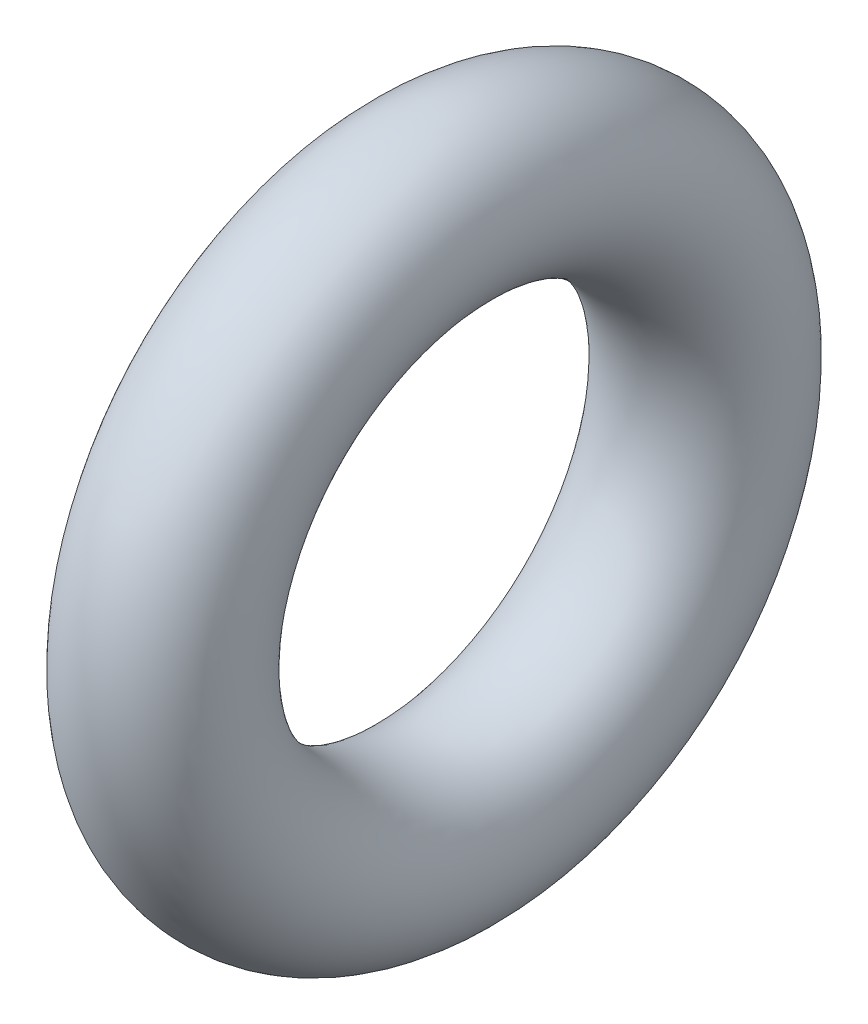
ISO-10303-21;
HEADER;
FILE_DESCRIPTION(('STEP AP214'),'2;1');
FILE_NAME('part.step','',(''),(''),'','','');
FILE_SCHEMA(('AUTOMOTIVE_DESIGN { 1 0 10303 214 1 1 1 1 }'));
ENDSEC;
DATA;
#1=APPLICATION_CONTEXT('core data for automotive mechanical design processes');
#2=APPLICATION_PROTOCOL_DEFINITION('international standard','automotive_design',2000,#1);
#3=PRODUCT_CONTEXT('',#1,'mechanical');
#4=PRODUCT('Part','Part','',(#3));
#5=PRODUCT_RELATED_PRODUCT_CATEGORY('part','',(#4));
#6=PRODUCT_DEFINITION_FORMATION('','',#4);
#7=PRODUCT_DEFINITION_CONTEXT('part definition',#1,'design');
#8=PRODUCT_DEFINITION('design','',#6,#7);
#9=PRODUCT_DEFINITION_SHAPE('','',#8);
#10=(LENGTH_UNIT() NAMED_UNIT(*) SI_UNIT(.MILLI.,.METRE.));
#11=(NAMED_UNIT(*) PLANE_ANGLE_UNIT() SI_UNIT($,.RADIAN.));
#12=(NAMED_UNIT(*) SI_UNIT($,.STERADIAN.) SOLID_ANGLE_UNIT());
#13=UNCERTAINTY_MEASURE_WITH_UNIT(LENGTH_MEASURE(1.E-05),#10,'distance_accuracy_value','');
#14=(GEOMETRIC_REPRESENTATION_CONTEXT(3) GLOBAL_UNCERTAINTY_ASSIGNED_CONTEXT((#13)) GLOBAL_UNIT_ASSIGNED_CONTEXT((#10,
#11,#12)) REPRESENTATION_CONTEXT('',''));
#15=CARTESIAN_POINT('',(0.,0.,0.));
#16=DIRECTION('',(0.,0.,1.));
#17=DIRECTION('',(1.,0.,0.));
#18=AXIS2_PLACEMENT_3D('',#15,#16,#17);
#19=CARTESIAN_POINT('',(2.,0.,0.));
#20=DIRECTION('',(1.,0.,0.));
#21=DIRECTION('',(0.,-1.,0.));
#22=AXIS2_PLACEMENT_3D('',#19,#20,#21);
#23=TOROIDAL_SURFACE('',#22,2.75,0.833333333333334);
#24=CARTESIAN_POINT('',(2.,-3.58333333333333,0.));
#25=VERTEX_POINT('',#24);
#26=VERTEX_LOOP('',#25);
#27=FACE_BOUND('',#26,.T.);
#28=ADVANCED_FACE('F13',(#27),#23,.T.);
#29=CLOSED_SHELL('',(#28));
#30=MANIFOLD_SOLID_BREP('B1',#29);
#31=ADVANCED_BREP_SHAPE_REPRESENTATION('',(#18,#30),#14);
#32=SHAPE_DEFINITION_REPRESENTATION(#9,#31);
ENDSEC;
END-ISO-10303-21;
